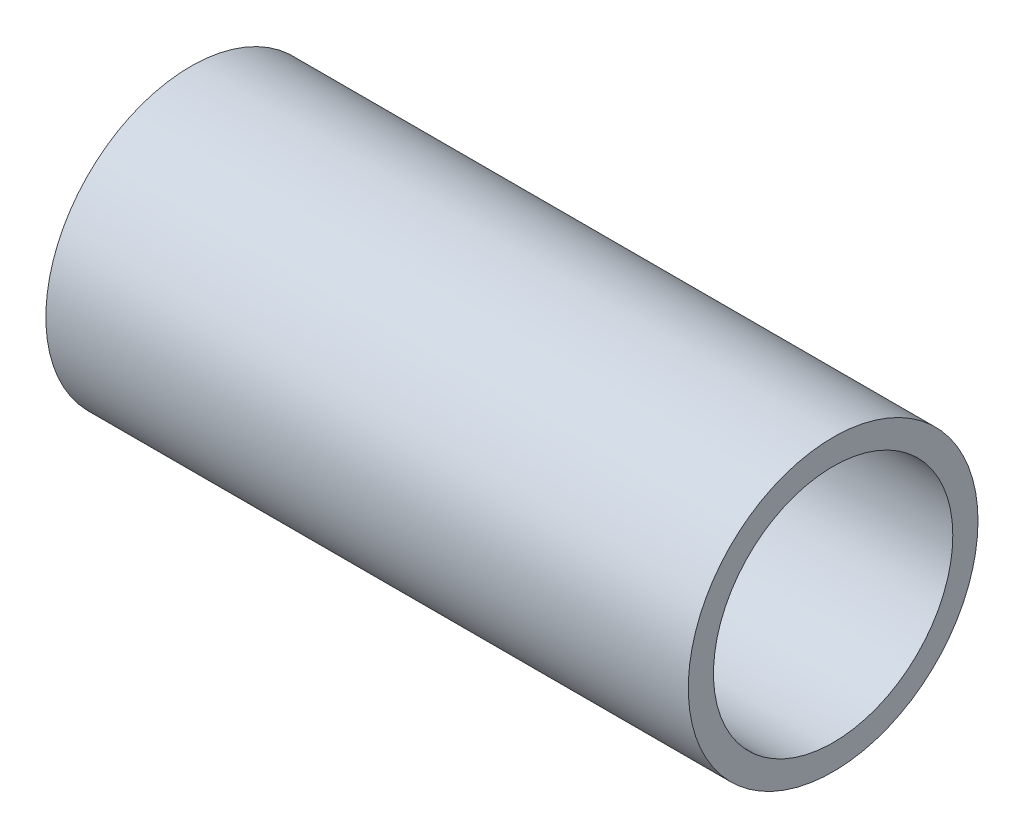
ISO-10303-21;
HEADER;
FILE_DESCRIPTION(('STEP AP214'),'2;1');
FILE_NAME('part.step','',(''),(''),'','','');
FILE_SCHEMA(('AUTOMOTIVE_DESIGN { 1 0 10303 214 1 1 1 1 }'));
ENDSEC;
DATA;
#1=APPLICATION_CONTEXT('core data for automotive mechanical design processes');
#2=APPLICATION_PROTOCOL_DEFINITION('international standard','automotive_design',2000,#1);
#3=PRODUCT_CONTEXT('',#1,'mechanical');
#4=PRODUCT('Part','Part','',(#3));
#5=PRODUCT_RELATED_PRODUCT_CATEGORY('part','',(#4));
#6=PRODUCT_DEFINITION_FORMATION('','',#4);
#7=PRODUCT_DEFINITION_CONTEXT('part definition',#1,'design');
#8=PRODUCT_DEFINITION('design','',#6,#7);
#9=PRODUCT_DEFINITION_SHAPE('','',#8);
#10=(LENGTH_UNIT() NAMED_UNIT(*) SI_UNIT(.MILLI.,.METRE.));
#11=(NAMED_UNIT(*) PLANE_ANGLE_UNIT() SI_UNIT($,.RADIAN.));
#12=(NAMED_UNIT(*) SI_UNIT($,.STERADIAN.) SOLID_ANGLE_UNIT());
#13=UNCERTAINTY_MEASURE_WITH_UNIT(LENGTH_MEASURE(1.E-05),#10,'distance_accuracy_value','');
#14=(GEOMETRIC_REPRESENTATION_CONTEXT(3) GLOBAL_UNCERTAINTY_ASSIGNED_CONTEXT((#13)) GLOBAL_UNIT_ASSIGNED_CONTEXT((#10,
#11,#12)) REPRESENTATION_CONTEXT('',''));
#15=CARTESIAN_POINT('',(0.,0.,0.));
#16=DIRECTION('',(0.,0.,1.));
#17=DIRECTION('',(1.,0.,0.));
#18=AXIS2_PLACEMENT_3D('',#15,#16,#17);
#19=CARTESIAN_POINT('',(25.5,0.,0.));
#20=DIRECTION('',(1.,0.,0.));
#21=DIRECTION('',(0.,0.,-1.));
#22=AXIS2_PLACEMENT_3D('',#19,#20,#21);
#23=PLANE('',#22);
#24=CARTESIAN_POINT('',(25.5,0.,0.));
#25=DIRECTION('',(1.,0.,0.));
#26=DIRECTION('',(0.,0.,-1.));
#27=AXIS2_PLACEMENT_3D('',#24,#25,#26);
#28=CIRCLE('',#27,5.75);
#29=CARTESIAN_POINT('',(25.5,0.,-5.75));
#30=VERTEX_POINT('',#29);
#31=EDGE_CURVE('E11',#30,#30,#28,.T.);
#32=ORIENTED_EDGE('',*,*,#31,.T.);
#33=EDGE_LOOP('',(#32));
#34=FACE_BOUND('',#33,.T.);
#35=CARTESIAN_POINT('',(25.5,0.,0.));
#36=DIRECTION('',(1.,0.,0.));
#37=DIRECTION('',(0.,0.,-1.));
#38=AXIS2_PLACEMENT_3D('',#35,#36,#37);
#39=CIRCLE('',#38,4.75);
#40=CARTESIAN_POINT('',(25.5,0.,-4.75));
#41=VERTEX_POINT('',#40);
#42=EDGE_CURVE('E48',#41,#41,#39,.T.);
#43=ORIENTED_EDGE('',*,*,#42,.F.);
#44=EDGE_LOOP('',(#43));
#45=FACE_BOUND('',#44,.T.);
#46=ADVANCED_FACE('F37',(#34,#45),#23,.T.);
#47=CARTESIAN_POINT('',(0.,0.,0.));
#48=DIRECTION('',(1.,0.,0.));
#49=DIRECTION('',(0.,0.,-1.));
#50=AXIS2_PLACEMENT_3D('',#47,#48,#49);
#51=PLANE('',#50);
#52=CARTESIAN_POINT('',(0.,0.,0.));
#53=DIRECTION('',(1.,0.,0.));
#54=DIRECTION('',(0.,0.,-1.));
#55=AXIS2_PLACEMENT_3D('',#52,#53,#54);
#56=CIRCLE('',#55,5.75);
#57=CARTESIAN_POINT('',(0.,0.,-5.75));
#58=VERTEX_POINT('',#57);
#59=EDGE_CURVE('E41',#58,#58,#56,.T.);
#60=ORIENTED_EDGE('',*,*,#59,.F.);
#61=EDGE_LOOP('',(#60));
#62=FACE_BOUND('',#61,.T.);
#63=CARTESIAN_POINT('',(0.,0.,0.));
#64=DIRECTION('',(1.,0.,0.));
#65=DIRECTION('',(0.,0.,-1.));
#66=AXIS2_PLACEMENT_3D('',#63,#64,#65);
#67=CIRCLE('',#66,4.75);
#68=CARTESIAN_POINT('',(0.,0.,-4.75));
#69=VERTEX_POINT('',#68);
#70=EDGE_CURVE('E50',#69,#69,#67,.T.);
#71=ORIENTED_EDGE('',*,*,#70,.T.);
#72=EDGE_LOOP('',(#71));
#73=FACE_BOUND('',#72,.T.);
#74=ADVANCED_FACE('F60',(#62,#73),#51,.F.);
#75=CARTESIAN_POINT('',(25.5,0.,0.));
#76=DIRECTION('',(-1.,0.,0.));
#77=DIRECTION('',(0.,0.,1.));
#78=AXIS2_PLACEMENT_3D('',#75,#76,#77);
#79=CYLINDRICAL_SURFACE('',#78,5.75);
#80=ORIENTED_EDGE('',*,*,#31,.F.);
#81=EDGE_LOOP('',(#80));
#82=FACE_BOUND('',#81,.T.);
#83=ORIENTED_EDGE('',*,*,#59,.T.);
#84=EDGE_LOOP('',(#83));
#85=FACE_BOUND('',#84,.T.);
#86=ADVANCED_FACE('F39',(#82,#85),#79,.T.);
#87=CARTESIAN_POINT('',(25.5,0.,0.));
#88=DIRECTION('',(-1.,0.,0.));
#89=DIRECTION('',(0.,0.,1.));
#90=AXIS2_PLACEMENT_3D('',#87,#88,#89);
#91=CYLINDRICAL_SURFACE('',#90,4.75);
#92=ORIENTED_EDGE('',*,*,#42,.T.);
#93=EDGE_LOOP('',(#92));
#94=FACE_BOUND('',#93,.T.);
#95=ORIENTED_EDGE('',*,*,#70,.F.);
#96=EDGE_LOOP('',(#95));
#97=FACE_BOUND('',#96,.T.);
#98=ADVANCED_FACE('F56',(#94,#97),#91,.F.);
#99=CLOSED_SHELL('',(#46,#74,#86,#98));
#100=MANIFOLD_SOLID_BREP('B2',#99);
#101=ADVANCED_BREP_SHAPE_REPRESENTATION('',(#18,#100),#14);
#102=SHAPE_DEFINITION_REPRESENTATION(#9,#101);
ENDSEC;
END-ISO-10303-21;
